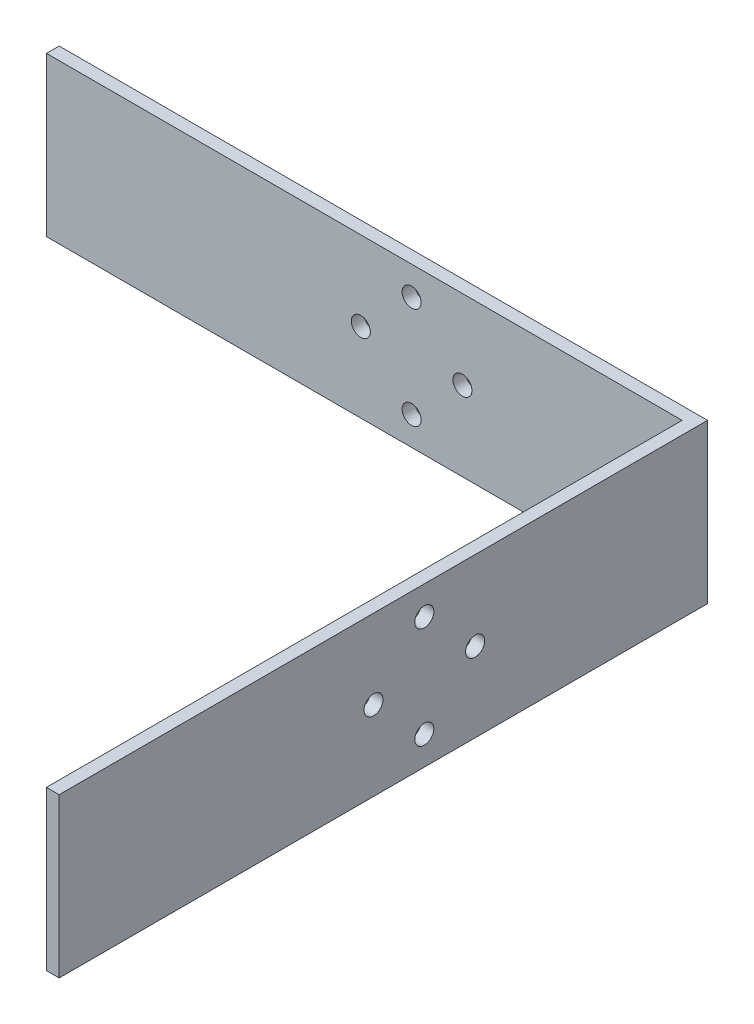
ISO-10303-21;
HEADER;
FILE_DESCRIPTION(('STEP AP214'),'2;1');
FILE_NAME('part.step','',(''),(''),'','','');
FILE_SCHEMA(('AUTOMOTIVE_DESIGN { 1 0 10303 214 1 1 1 1 }'));
ENDSEC;
DATA;
#1=APPLICATION_CONTEXT('core data for automotive mechanical design processes');
#2=APPLICATION_PROTOCOL_DEFINITION('international standard','automotive_design',2000,#1);
#3=PRODUCT_CONTEXT('',#1,'mechanical');
#4=PRODUCT('Part','Part','',(#3));
#5=PRODUCT_RELATED_PRODUCT_CATEGORY('part','',(#4));
#6=PRODUCT_DEFINITION_FORMATION('','',#4);
#7=PRODUCT_DEFINITION_CONTEXT('part definition',#1,'design');
#8=PRODUCT_DEFINITION('design','',#6,#7);
#9=PRODUCT_DEFINITION_SHAPE('','',#8);
#10=(LENGTH_UNIT() NAMED_UNIT(*) SI_UNIT(.MILLI.,.METRE.));
#11=(NAMED_UNIT(*) PLANE_ANGLE_UNIT() SI_UNIT($,.RADIAN.));
#12=(NAMED_UNIT(*) SI_UNIT($,.STERADIAN.) SOLID_ANGLE_UNIT());
#13=UNCERTAINTY_MEASURE_WITH_UNIT(LENGTH_MEASURE(1.E-05),#10,'distance_accuracy_value','');
#14=(GEOMETRIC_REPRESENTATION_CONTEXT(3) GLOBAL_UNCERTAINTY_ASSIGNED_CONTEXT((#13)) GLOBAL_UNIT_ASSIGNED_CONTEXT((#10,
#11,#12)) REPRESENTATION_CONTEXT('',''));
#15=CARTESIAN_POINT('',(0.,0.,0.));
#16=DIRECTION('',(0.,0.,1.));
#17=DIRECTION('',(1.,0.,0.));
#18=AXIS2_PLACEMENT_3D('',#15,#16,#17);
#19=CARTESIAN_POINT('',(0.,-25.,2.00000000000001));
#20=DIRECTION('',(-1.,0.,0.));
#21=DIRECTION('',(0.,0.,1.));
#22=AXIS2_PLACEMENT_3D('',#19,#20,#21);
#23=PLANE('',#22);
#24=DIRECTION('',(0.,0.,1.));
#25=VECTOR('',#24,1.);
#26=CARTESIAN_POINT('',(0.,0.,2.00000000000001));
#27=LINE('',#26,#25);
#28=CARTESIAN_POINT('',(0.,0.,0.));
#29=VERTEX_POINT('',#28);
#30=CARTESIAN_POINT('',(0.,0.,2.00000000000001));
#31=VERTEX_POINT('',#30);
#32=EDGE_CURVE('E123',#29,#31,#27,.T.);
#33=ORIENTED_EDGE('',*,*,#32,.F.);
#34=DIRECTION('',(0.,1.,0.));
#35=VECTOR('',#34,1.);
#36=CARTESIAN_POINT('',(0.,-25.,0.));
#37=LINE('',#36,#35);
#38=CARTESIAN_POINT('',(0.,-25.,0.));
#39=VERTEX_POINT('',#38);
#40=EDGE_CURVE('E11',#39,#29,#37,.T.);
#41=ORIENTED_EDGE('',*,*,#40,.F.);
#42=DIRECTION('',(0.,0.,1.));
#43=VECTOR('',#42,1.);
#44=CARTESIAN_POINT('',(0.,-25.,2.00000000000001));
#45=LINE('',#44,#43);
#46=CARTESIAN_POINT('',(0.,-25.,2.00000000000001));
#47=VERTEX_POINT('',#46);
#48=EDGE_CURVE('E138',#39,#47,#45,.T.);
#49=ORIENTED_EDGE('',*,*,#48,.T.);
#50=DIRECTION('',(0.,1.,0.));
#51=VECTOR('',#50,1.);
#52=CARTESIAN_POINT('',(0.,-25.,2.00000000000001));
#53=LINE('',#52,#51);
#54=EDGE_CURVE('E87',#47,#31,#53,.T.);
#55=ORIENTED_EDGE('',*,*,#54,.T.);
#56=EDGE_LOOP('',(#33,#41,#49,#55));
#57=FACE_BOUND('',#56,.T.);
#58=ADVANCED_FACE('F37',(#57),#23,.T.);
#59=CARTESIAN_POINT('',(0.,-25.,0.));
#60=DIRECTION('',(0.,0.,-1.));
#61=DIRECTION('',(-1.,0.,0.));
#62=AXIS2_PLACEMENT_3D('',#59,#60,#61);
#63=PLANE('',#62);
#64=CARTESIAN_POINT('',(49.4999998807907,-12.5,0.));
#65=DIRECTION('',(0.,0.,-1.));
#66=DIRECTION('',(-1.,0.,0.));
#67=AXIS2_PLACEMENT_3D('',#64,#65,#66);
#68=CIRCLE('',#67,1.49999999999998);
#69=CARTESIAN_POINT('',(47.9999998807907,-12.5,0.));
#70=VERTEX_POINT('',#69);
#71=EDGE_CURVE('E149',#70,#70,#68,.T.);
#72=ORIENTED_EDGE('',*,*,#71,.F.);
#73=EDGE_LOOP('',(#72));
#74=FACE_BOUND('',#73,.T.);
#75=CARTESIAN_POINT('',(57.5,-20.5000001192093,0.));
#76=DIRECTION('',(0.,0.,-1.));
#77=DIRECTION('',(-1.,0.,0.));
#78=AXIS2_PLACEMENT_3D('',#75,#76,#77);
#79=CIRCLE('',#78,1.5);
#80=CARTESIAN_POINT('',(56.,-20.5000001192093,0.));
#81=VERTEX_POINT('',#80);
#82=EDGE_CURVE('E177',#81,#81,#79,.T.);
#83=ORIENTED_EDGE('',*,*,#82,.F.);
#84=EDGE_LOOP('',(#83));
#85=FACE_BOUND('',#84,.T.);
#86=CARTESIAN_POINT('',(57.5,-4.49999988079073,0.));
#87=DIRECTION('',(0.,0.,-1.));
#88=DIRECTION('',(-1.,0.,0.));
#89=AXIS2_PLACEMENT_3D('',#86,#87,#88);
#90=CIRCLE('',#89,1.5);
#91=CARTESIAN_POINT('',(56.,-4.49999988079073,0.));
#92=VERTEX_POINT('',#91);
#93=EDGE_CURVE('E172',#92,#92,#90,.T.);
#94=ORIENTED_EDGE('',*,*,#93,.F.);
#95=EDGE_LOOP('',(#94));
#96=FACE_BOUND('',#95,.T.);
#97=CARTESIAN_POINT('',(65.5000001192093,-12.5,0.));
#98=DIRECTION('',(0.,0.,-1.));
#99=DIRECTION('',(-1.,0.,0.));
#100=AXIS2_PLACEMENT_3D('',#97,#98,#99);
#101=CIRCLE('',#100,1.5);
#102=CARTESIAN_POINT('',(64.0000001192093,-12.5,0.));
#103=VERTEX_POINT('',#102);
#104=EDGE_CURVE('E168',#103,#103,#101,.T.);
#105=ORIENTED_EDGE('',*,*,#104,.F.);
#106=EDGE_LOOP('',(#105));
#107=FACE_BOUND('',#106,.T.);
#108=DIRECTION('',(-1.,0.,0.));
#109=VECTOR('',#108,1.);
#110=CARTESIAN_POINT('',(0.,0.,0.));
#111=LINE('',#110,#109);
#112=CARTESIAN_POINT('',(102.1,0.,0.));
#113=VERTEX_POINT('',#112);
#114=EDGE_CURVE('E136',#113,#29,#111,.T.);
#115=ORIENTED_EDGE('',*,*,#114,.F.);
#116=DIRECTION('',(0.,1.,0.));
#117=VECTOR('',#116,1.);
#118=CARTESIAN_POINT('',(102.1,-25.,0.));
#119=LINE('',#118,#117);
#120=CARTESIAN_POINT('',(102.1,-25.,0.));
#121=VERTEX_POINT('',#120);
#122=EDGE_CURVE('E46',#121,#113,#119,.T.);
#123=ORIENTED_EDGE('',*,*,#122,.F.);
#124=DIRECTION('',(-1.,0.,0.));
#125=VECTOR('',#124,1.);
#126=CARTESIAN_POINT('',(0.,-25.,0.));
#127=LINE('',#126,#125);
#128=EDGE_CURVE('E113',#121,#39,#127,.T.);
#129=ORIENTED_EDGE('',*,*,#128,.T.);
#130=ORIENTED_EDGE('',*,*,#40,.T.);
#131=EDGE_LOOP('',(#115,#123,#129,#130));
#132=FACE_BOUND('',#131,.T.);
#133=ADVANCED_FACE('F185',(#74,#85,#96,#107,#132),#63,.T.);
#134=CARTESIAN_POINT('',(102.1,-25.,0.));
#135=DIRECTION('',(1.,0.,0.));
#136=DIRECTION('',(0.,0.,-1.));
#137=AXIS2_PLACEMENT_3D('',#134,#135,#136);
#138=PLANE('',#137);
#139=CARTESIAN_POINT('',(102.1,-4.49999988079071,44.6));
#140=DIRECTION('',(1.,0.,0.));
#141=DIRECTION('',(0.,0.,-1.));
#142=AXIS2_PLACEMENT_3D('',#139,#140,#141);
#143=CIRCLE('',#142,1.5);
#144=CARTESIAN_POINT('',(102.1,-4.49999988079071,43.1));
#145=VERTEX_POINT('',#144);
#146=EDGE_CURVE('E161',#145,#145,#143,.T.);
#147=ORIENTED_EDGE('',*,*,#146,.F.);
#148=EDGE_LOOP('',(#147));
#149=FACE_BOUND('',#148,.T.);
#150=CARTESIAN_POINT('',(102.1,-12.5,36.5999998807907));
#151=DIRECTION('',(1.,0.,0.));
#152=DIRECTION('',(0.,0.,-1.));
#153=AXIS2_PLACEMENT_3D('',#150,#151,#152);
#154=CIRCLE('',#153,1.5);
#155=CARTESIAN_POINT('',(102.1,-12.5,35.0999998807907));
#156=VERTEX_POINT('',#155);
#157=EDGE_CURVE('E255',#156,#156,#154,.T.);
#158=ORIENTED_EDGE('',*,*,#157,.F.);
#159=EDGE_LOOP('',(#158));
#160=FACE_BOUND('',#159,.T.);
#161=CARTESIAN_POINT('',(102.1,-12.5,52.6000001192093));
#162=DIRECTION('',(1.,0.,0.));
#163=DIRECTION('',(0.,0.,-1.));
#164=AXIS2_PLACEMENT_3D('',#161,#162,#163);
#165=CIRCLE('',#164,1.5);
#166=CARTESIAN_POINT('',(102.1,-12.5,51.1000001192093));
#167=VERTEX_POINT('',#166);
#168=EDGE_CURVE('E258',#167,#167,#165,.T.);
#169=ORIENTED_EDGE('',*,*,#168,.F.);
#170=EDGE_LOOP('',(#169));
#171=FACE_BOUND('',#170,.T.);
#172=CARTESIAN_POINT('',(102.1,-20.5000001192093,44.6));
#173=DIRECTION('',(1.,0.,0.));
#174=DIRECTION('',(0.,0.,-1.));
#175=AXIS2_PLACEMENT_3D('',#172,#173,#174);
#176=CIRCLE('',#175,1.5);
#177=CARTESIAN_POINT('',(102.1,-20.5000001192093,43.1));
#178=VERTEX_POINT('',#177);
#179=EDGE_CURVE('E263',#178,#178,#176,.T.);
#180=ORIENTED_EDGE('',*,*,#179,.F.);
#181=EDGE_LOOP('',(#180));
#182=FACE_BOUND('',#181,.T.);
#183=DIRECTION('',(0.,0.,-1.));
#184=VECTOR('',#183,1.);
#185=CARTESIAN_POINT('',(102.1,0.,0.));
#186=LINE('',#185,#184);
#187=CARTESIAN_POINT('',(102.1,0.,102.1));
#188=VERTEX_POINT('',#187);
#189=EDGE_CURVE('E100',#188,#113,#186,.T.);
#190=ORIENTED_EDGE('',*,*,#189,.F.);
#191=DIRECTION('',(0.,1.,0.));
#192=VECTOR('',#191,1.);
#193=CARTESIAN_POINT('',(102.1,-25.,102.1));
#194=LINE('',#193,#192);
#195=CARTESIAN_POINT('',(102.1,-25.,102.1));
#196=VERTEX_POINT('',#195);
#197=EDGE_CURVE('E95',#196,#188,#194,.T.);
#198=ORIENTED_EDGE('',*,*,#197,.F.);
#199=DIRECTION('',(0.,0.,-1.));
#200=VECTOR('',#199,1.);
#201=CARTESIAN_POINT('',(102.1,-25.,0.));
#202=LINE('',#201,#200);
#203=EDGE_CURVE('E98',#196,#121,#202,.T.);
#204=ORIENTED_EDGE('',*,*,#203,.T.);
#205=ORIENTED_EDGE('',*,*,#122,.T.);
#206=EDGE_LOOP('',(#190,#198,#204,#205));
#207=FACE_BOUND('',#206,.T.);
#208=ADVANCED_FACE('F97',(#149,#160,#171,#182,#207),#138,.T.);
#209=CARTESIAN_POINT('',(102.1,-25.,102.1));
#210=DIRECTION('',(0.,0.,1.));
#211=DIRECTION('',(1.,0.,0.));
#212=AXIS2_PLACEMENT_3D('',#209,#210,#211);
#213=PLANE('',#212);
#214=DIRECTION('',(1.,0.,0.));
#215=VECTOR('',#214,1.);
#216=CARTESIAN_POINT('',(102.1,0.,102.1));
#217=LINE('',#216,#215);
#218=CARTESIAN_POINT('',(100.1,0.,102.1));
#219=VERTEX_POINT('',#218);
#220=EDGE_CURVE('E133',#219,#188,#217,.T.);
#221=ORIENTED_EDGE('',*,*,#220,.F.);
#222=DIRECTION('',(0.,1.,0.));
#223=VECTOR('',#222,1.);
#224=CARTESIAN_POINT('',(100.1,-25.,102.1));
#225=LINE('',#224,#223);
#226=CARTESIAN_POINT('',(100.1,-25.,102.1));
#227=VERTEX_POINT('',#226);
#228=EDGE_CURVE('E105',#227,#219,#225,.T.);
#229=ORIENTED_EDGE('',*,*,#228,.F.);
#230=DIRECTION('',(1.,0.,0.));
#231=VECTOR('',#230,1.);
#232=CARTESIAN_POINT('',(102.1,-25.,102.1));
#233=LINE('',#232,#231);
#234=EDGE_CURVE('E111',#227,#196,#233,.T.);
#235=ORIENTED_EDGE('',*,*,#234,.T.);
#236=ORIENTED_EDGE('',*,*,#197,.T.);
#237=EDGE_LOOP('',(#221,#229,#235,#236));
#238=FACE_BOUND('',#237,.T.);
#239=ADVANCED_FACE('F115',(#238),#213,.T.);
#240=CARTESIAN_POINT('',(100.1,-25.,102.1));
#241=DIRECTION('',(-1.,0.,0.));
#242=DIRECTION('',(0.,0.,1.));
#243=AXIS2_PLACEMENT_3D('',#240,#241,#242);
#244=PLANE('',#243);
#245=CARTESIAN_POINT('',(100.1,-4.49999988079071,44.6));
#246=DIRECTION('',(-1.,0.,0.));
#247=DIRECTION('',(0.,0.,1.));
#248=AXIS2_PLACEMENT_3D('',#245,#246,#247);
#249=CIRCLE('',#248,1.5);
#250=CARTESIAN_POINT('',(100.1,-4.49999988079071,46.1));
#251=VERTEX_POINT('',#250);
#252=EDGE_CURVE('E40',#251,#251,#249,.T.);
#253=ORIENTED_EDGE('',*,*,#252,.F.);
#254=EDGE_LOOP('',(#253));
#255=FACE_BOUND('',#254,.T.);
#256=CARTESIAN_POINT('',(100.1,-12.5,36.5999998807907));
#257=DIRECTION('',(-1.,0.,0.));
#258=DIRECTION('',(0.,0.,1.));
#259=AXIS2_PLACEMENT_3D('',#256,#257,#258);
#260=CIRCLE('',#259,1.5);
#261=CARTESIAN_POINT('',(100.1,-12.5,38.0999998807907));
#262=VERTEX_POINT('',#261);
#263=EDGE_CURVE('E163',#262,#262,#260,.T.);
#264=ORIENTED_EDGE('',*,*,#263,.F.);
#265=EDGE_LOOP('',(#264));
#266=FACE_BOUND('',#265,.T.);
#267=CARTESIAN_POINT('',(100.1,-12.5,52.6000001192093));
#268=DIRECTION('',(-1.,0.,0.));
#269=DIRECTION('',(0.,0.,1.));
#270=AXIS2_PLACEMENT_3D('',#267,#268,#269);
#271=CIRCLE('',#270,1.5);
#272=CARTESIAN_POINT('',(100.1,-12.5,54.1000001192093));
#273=VERTEX_POINT('',#272);
#274=EDGE_CURVE('E160',#273,#273,#271,.T.);
#275=ORIENTED_EDGE('',*,*,#274,.F.);
#276=EDGE_LOOP('',(#275));
#277=FACE_BOUND('',#276,.T.);
#278=CARTESIAN_POINT('',(100.1,-20.5000001192093,44.6));
#279=DIRECTION('',(-1.,0.,0.));
#280=DIRECTION('',(0.,0.,1.));
#281=AXIS2_PLACEMENT_3D('',#278,#279,#280);
#282=CIRCLE('',#281,1.5);
#283=CARTESIAN_POINT('',(100.1,-20.5000001192093,46.1));
#284=VERTEX_POINT('',#283);
#285=EDGE_CURVE('E157',#284,#284,#282,.T.);
#286=ORIENTED_EDGE('',*,*,#285,.F.);
#287=EDGE_LOOP('',(#286));
#288=FACE_BOUND('',#287,.T.);
#289=DIRECTION('',(0.,0.,1.));
#290=VECTOR('',#289,1.);
#291=CARTESIAN_POINT('',(100.1,0.,102.1));
#292=LINE('',#291,#290);
#293=CARTESIAN_POINT('',(100.1,0.,2.));
#294=VERTEX_POINT('',#293);
#295=EDGE_CURVE('E130',#294,#219,#292,.T.);
#296=ORIENTED_EDGE('',*,*,#295,.F.);
#297=DIRECTION('',(0.,1.,0.));
#298=VECTOR('',#297,1.);
#299=CARTESIAN_POINT('',(100.1,-25.,2.));
#300=LINE('',#299,#298);
#301=CARTESIAN_POINT('',(100.1,-25.,2.));
#302=VERTEX_POINT('',#301);
#303=EDGE_CURVE('E142',#302,#294,#300,.T.);
#304=ORIENTED_EDGE('',*,*,#303,.F.);
#305=DIRECTION('',(0.,0.,1.));
#306=VECTOR('',#305,1.);
#307=CARTESIAN_POINT('',(100.1,-25.,102.1));
#308=LINE('',#307,#306);
#309=EDGE_CURVE('E116',#302,#227,#308,.T.);
#310=ORIENTED_EDGE('',*,*,#309,.T.);
#311=ORIENTED_EDGE('',*,*,#228,.T.);
#312=EDGE_LOOP('',(#296,#304,#310,#311));
#313=FACE_BOUND('',#312,.T.);
#314=ADVANCED_FACE('F202',(#255,#266,#277,#288,#313),#244,.T.);
#315=CARTESIAN_POINT('',(100.1,-25.,2.));
#316=DIRECTION('',(0.,0.,1.));
#317=DIRECTION('',(1.,0.,0.));
#318=AXIS2_PLACEMENT_3D('',#315,#316,#317);
#319=PLANE('',#318);
#320=CARTESIAN_POINT('',(49.4999998807907,-12.5,2.00000000000001));
#321=DIRECTION('',(0.,0.,1.));
#322=DIRECTION('',(1.,0.,0.));
#323=AXIS2_PLACEMENT_3D('',#320,#321,#322);
#324=CIRCLE('',#323,1.49999999999998);
#325=CARTESIAN_POINT('',(50.9999998807907,-12.5,2.00000000000001));
#326=VERTEX_POINT('',#325);
#327=EDGE_CURVE('E127',#326,#326,#324,.T.);
#328=ORIENTED_EDGE('',*,*,#327,.F.);
#329=EDGE_LOOP('',(#328));
#330=FACE_BOUND('',#329,.T.);
#331=CARTESIAN_POINT('',(57.5,-20.5000001192093,2.00000000000001));
#332=DIRECTION('',(0.,0.,1.));
#333=DIRECTION('',(1.,0.,0.));
#334=AXIS2_PLACEMENT_3D('',#331,#332,#333);
#335=CIRCLE('',#334,1.5);
#336=CARTESIAN_POINT('',(59.,-20.5000001192093,2.00000000000001));
#337=VERTEX_POINT('',#336);
#338=EDGE_CURVE('E152',#337,#337,#335,.T.);
#339=ORIENTED_EDGE('',*,*,#338,.F.);
#340=EDGE_LOOP('',(#339));
#341=FACE_BOUND('',#340,.T.);
#342=CARTESIAN_POINT('',(57.5,-4.49999988079073,2.00000000000001));
#343=DIRECTION('',(0.,0.,1.));
#344=DIRECTION('',(1.,0.,0.));
#345=AXIS2_PLACEMENT_3D('',#342,#343,#344);
#346=CIRCLE('',#345,1.5);
#347=CARTESIAN_POINT('',(59.,-4.49999988079073,2.00000000000001));
#348=VERTEX_POINT('',#347);
#349=EDGE_CURVE('E148',#348,#348,#346,.T.);
#350=ORIENTED_EDGE('',*,*,#349,.F.);
#351=EDGE_LOOP('',(#350));
#352=FACE_BOUND('',#351,.T.);
#353=CARTESIAN_POINT('',(65.5000001192093,-12.5,2.00000000000001));
#354=DIRECTION('',(0.,0.,1.));
#355=DIRECTION('',(1.,0.,0.));
#356=AXIS2_PLACEMENT_3D('',#353,#354,#355);
#357=CIRCLE('',#356,1.5);
#358=CARTESIAN_POINT('',(67.0000001192093,-12.5,2.00000000000001));
#359=VERTEX_POINT('',#358);
#360=EDGE_CURVE('E145',#359,#359,#357,.T.);
#361=ORIENTED_EDGE('',*,*,#360,.F.);
#362=EDGE_LOOP('',(#361));
#363=FACE_BOUND('',#362,.T.);
#364=DIRECTION('',(1.,0.,0.));
#365=VECTOR('',#364,1.);
#366=CARTESIAN_POINT('',(100.1,0.,2.));
#367=LINE('',#366,#365);
#368=EDGE_CURVE('E126',#31,#294,#367,.T.);
#369=ORIENTED_EDGE('',*,*,#368,.F.);
#370=ORIENTED_EDGE('',*,*,#54,.F.);
#371=DIRECTION('',(1.,0.,0.));
#372=VECTOR('',#371,1.);
#373=CARTESIAN_POINT('',(100.1,-25.,2.));
#374=LINE('',#373,#372);
#375=EDGE_CURVE('E118',#47,#302,#374,.T.);
#376=ORIENTED_EDGE('',*,*,#375,.T.);
#377=ORIENTED_EDGE('',*,*,#303,.T.);
#378=EDGE_LOOP('',(#369,#370,#376,#377));
#379=FACE_BOUND('',#378,.T.);
#380=ADVANCED_FACE('F181',(#330,#341,#352,#363,#379),#319,.T.);
#381=CARTESIAN_POINT('',(0.,-25.,0.));
#382=DIRECTION('',(0.,-1.,0.));
#383=DIRECTION('',(0.,0.,-1.));
#384=AXIS2_PLACEMENT_3D('',#381,#382,#383);
#385=PLANE('',#384);
#386=ORIENTED_EDGE('',*,*,#48,.F.);
#387=ORIENTED_EDGE('',*,*,#128,.F.);
#388=ORIENTED_EDGE('',*,*,#203,.F.);
#389=ORIENTED_EDGE('',*,*,#234,.F.);
#390=ORIENTED_EDGE('',*,*,#309,.F.);
#391=ORIENTED_EDGE('',*,*,#375,.F.);
#392=EDGE_LOOP('',(#386,#387,#388,#389,#390,#391));
#393=FACE_BOUND('',#392,.T.);
#394=ADVANCED_FACE('F109',(#393),#385,.T.);
#395=CARTESIAN_POINT('',(0.,0.,0.));
#396=DIRECTION('',(0.,-1.,0.));
#397=DIRECTION('',(0.,0.,-1.));
#398=AXIS2_PLACEMENT_3D('',#395,#396,#397);
#399=PLANE('',#398);
#400=ORIENTED_EDGE('',*,*,#32,.T.);
#401=ORIENTED_EDGE('',*,*,#368,.T.);
#402=ORIENTED_EDGE('',*,*,#295,.T.);
#403=ORIENTED_EDGE('',*,*,#220,.T.);
#404=ORIENTED_EDGE('',*,*,#189,.T.);
#405=ORIENTED_EDGE('',*,*,#114,.T.);
#406=EDGE_LOOP('',(#400,#401,#402,#403,#404,#405));
#407=FACE_BOUND('',#406,.T.);
#408=ADVANCED_FACE('F184',(#407),#399,.F.);
#409=CARTESIAN_POINT('',(65.5000001192093,-12.5,11.3137086675722));
#410=DIRECTION('',(0.,0.,-1.));
#411=DIRECTION('',(-1.,0.,0.));
#412=AXIS2_PLACEMENT_3D('',#409,#410,#411);
#413=CYLINDRICAL_SURFACE('',#412,1.5);
#414=ORIENTED_EDGE('',*,*,#360,.T.);
#415=EDGE_LOOP('',(#414));
#416=FACE_BOUND('',#415,.T.);
#417=ORIENTED_EDGE('',*,*,#104,.T.);
#418=EDGE_LOOP('',(#417));
#419=FACE_BOUND('',#418,.T.);
#420=ADVANCED_FACE('F218',(#416,#419),#413,.F.);
#421=CARTESIAN_POINT('',(57.5,-4.49999988079073,11.3137086675722));
#422=DIRECTION('',(0.,0.,-1.));
#423=DIRECTION('',(-1.,0.,0.));
#424=AXIS2_PLACEMENT_3D('',#421,#422,#423);
#425=CYLINDRICAL_SURFACE('',#424,1.5);
#426=ORIENTED_EDGE('',*,*,#349,.T.);
#427=EDGE_LOOP('',(#426));
#428=FACE_BOUND('',#427,.T.);
#429=ORIENTED_EDGE('',*,*,#93,.T.);
#430=EDGE_LOOP('',(#429));
#431=FACE_BOUND('',#430,.T.);
#432=ADVANCED_FACE('F220',(#428,#431),#425,.F.);
#433=CARTESIAN_POINT('',(57.5,-20.5000001192093,11.3137086675722));
#434=DIRECTION('',(0.,0.,-1.));
#435=DIRECTION('',(-1.,0.,0.));
#436=AXIS2_PLACEMENT_3D('',#433,#434,#435);
#437=CYLINDRICAL_SURFACE('',#436,1.5);
#438=ORIENTED_EDGE('',*,*,#338,.T.);
#439=EDGE_LOOP('',(#438));
#440=FACE_BOUND('',#439,.T.);
#441=ORIENTED_EDGE('',*,*,#82,.T.);
#442=EDGE_LOOP('',(#441));
#443=FACE_BOUND('',#442,.T.);
#444=ADVANCED_FACE('F226',(#440,#443),#437,.F.);
#445=CARTESIAN_POINT('',(49.4999998807907,-12.5,11.3137086675722));
#446=DIRECTION('',(0.,0.,-1.));
#447=DIRECTION('',(-1.,0.,0.));
#448=AXIS2_PLACEMENT_3D('',#445,#446,#447);
#449=CYLINDRICAL_SURFACE('',#448,1.49999999999998);
#450=ORIENTED_EDGE('',*,*,#327,.T.);
#451=EDGE_LOOP('',(#450));
#452=FACE_BOUND('',#451,.T.);
#453=ORIENTED_EDGE('',*,*,#71,.T.);
#454=EDGE_LOOP('',(#453));
#455=FACE_BOUND('',#454,.T.);
#456=ADVANCED_FACE('F232',(#452,#455),#449,.F.);
#457=CARTESIAN_POINT('',(77.1,-20.5000001192093,44.6));
#458=DIRECTION('',(1.,0.,0.));
#459=DIRECTION('',(0.,0.,-1.));
#460=AXIS2_PLACEMENT_3D('',#457,#458,#459);
#461=CYLINDRICAL_SURFACE('',#460,1.5);
#462=ORIENTED_EDGE('',*,*,#285,.T.);
#463=EDGE_LOOP('',(#462));
#464=FACE_BOUND('',#463,.T.);
#465=ORIENTED_EDGE('',*,*,#179,.T.);
#466=EDGE_LOOP('',(#465));
#467=FACE_BOUND('',#466,.T.);
#468=ADVANCED_FACE('F236',(#464,#467),#461,.F.);
#469=CARTESIAN_POINT('',(77.1,-12.5,52.6000001192093));
#470=DIRECTION('',(1.,0.,0.));
#471=DIRECTION('',(0.,0.,-1.));
#472=AXIS2_PLACEMENT_3D('',#469,#470,#471);
#473=CYLINDRICAL_SURFACE('',#472,1.5);
#474=ORIENTED_EDGE('',*,*,#274,.T.);
#475=EDGE_LOOP('',(#474));
#476=FACE_BOUND('',#475,.T.);
#477=ORIENTED_EDGE('',*,*,#168,.T.);
#478=EDGE_LOOP('',(#477));
#479=FACE_BOUND('',#478,.T.);
#480=ADVANCED_FACE('F240',(#476,#479),#473,.F.);
#481=CARTESIAN_POINT('',(77.1,-12.5,36.5999998807907));
#482=DIRECTION('',(1.,0.,0.));
#483=DIRECTION('',(0.,0.,-1.));
#484=AXIS2_PLACEMENT_3D('',#481,#482,#483);
#485=CYLINDRICAL_SURFACE('',#484,1.5);
#486=ORIENTED_EDGE('',*,*,#263,.T.);
#487=EDGE_LOOP('',(#486));
#488=FACE_BOUND('',#487,.T.);
#489=ORIENTED_EDGE('',*,*,#157,.T.);
#490=EDGE_LOOP('',(#489));
#491=FACE_BOUND('',#490,.T.);
#492=ADVANCED_FACE('F244',(#488,#491),#485,.F.);
#493=CARTESIAN_POINT('',(77.1,-4.49999988079071,44.6));
#494=DIRECTION('',(1.,0.,0.));
#495=DIRECTION('',(0.,0.,-1.));
#496=AXIS2_PLACEMENT_3D('',#493,#494,#495);
#497=CYLINDRICAL_SURFACE('',#496,1.5);
#498=ORIENTED_EDGE('',*,*,#252,.T.);
#499=EDGE_LOOP('',(#498));
#500=FACE_BOUND('',#499,.T.);
#501=ORIENTED_EDGE('',*,*,#146,.T.);
#502=EDGE_LOOP('',(#501));
#503=FACE_BOUND('',#502,.T.);
#504=ADVANCED_FACE('F248',(#500,#503),#497,.F.);
#505=CLOSED_SHELL('',(#58,#133,#208,#239,#314,#380,#394,#408,#420,#432,#444,#456,#468,#480,#492,#504));
#506=MANIFOLD_SOLID_BREP('B2',#505);
#507=ADVANCED_BREP_SHAPE_REPRESENTATION('',(#18,#506),#14);
#508=SHAPE_DEFINITION_REPRESENTATION(#9,#507);
ENDSEC;
END-ISO-10303-21;
